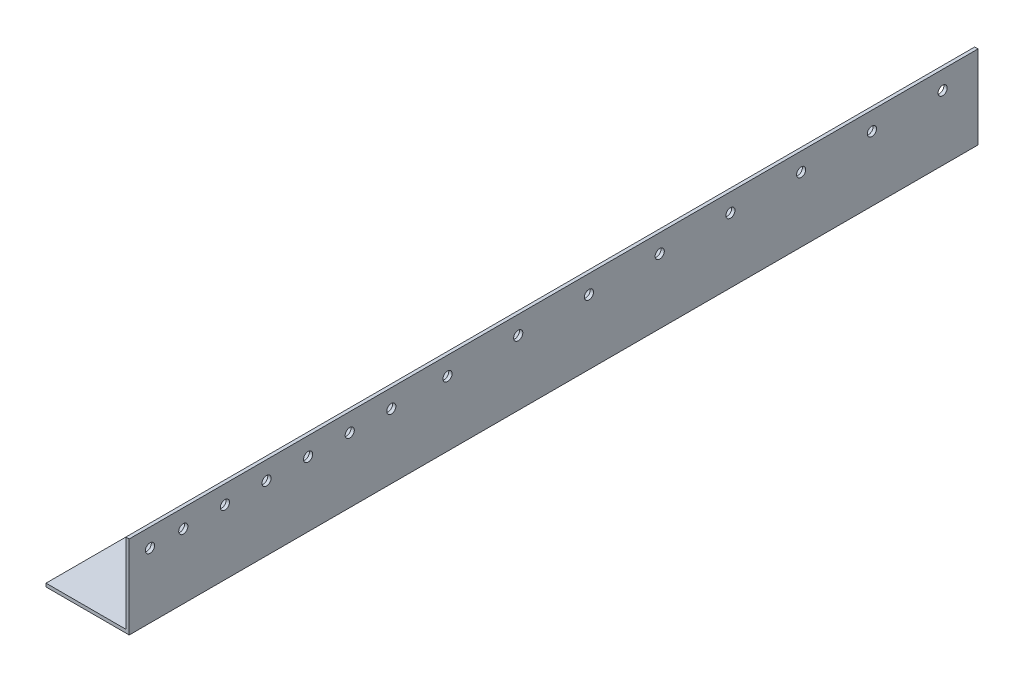
ISO-10303-21;
HEADER;
FILE_DESCRIPTION(('STEP AP214'),'2;1');
FILE_NAME('part.step','',(''),(''),'','','');
FILE_SCHEMA(('AUTOMOTIVE_DESIGN { 1 0 10303 214 1 1 1 1 }'));
ENDSEC;
DATA;
#1=APPLICATION_CONTEXT('core data for automotive mechanical design processes');
#2=APPLICATION_PROTOCOL_DEFINITION('international standard','automotive_design',2000,#1);
#3=PRODUCT_CONTEXT('',#1,'mechanical');
#4=PRODUCT('Part','Part','',(#3));
#5=PRODUCT_RELATED_PRODUCT_CATEGORY('part','',(#4));
#6=PRODUCT_DEFINITION_FORMATION('','',#4);
#7=PRODUCT_DEFINITION_CONTEXT('part definition',#1,'design');
#8=PRODUCT_DEFINITION('design','',#6,#7);
#9=PRODUCT_DEFINITION_SHAPE('','',#8);
#10=(LENGTH_UNIT() NAMED_UNIT(*) SI_UNIT(.MILLI.,.METRE.));
#11=(NAMED_UNIT(*) PLANE_ANGLE_UNIT() SI_UNIT($,.RADIAN.));
#12=(NAMED_UNIT(*) SI_UNIT($,.STERADIAN.) SOLID_ANGLE_UNIT());
#13=UNCERTAINTY_MEASURE_WITH_UNIT(LENGTH_MEASURE(1.E-05),#10,'distance_accuracy_value','');
#14=(GEOMETRIC_REPRESENTATION_CONTEXT(3) GLOBAL_UNCERTAINTY_ASSIGNED_CONTEXT((#13)) GLOBAL_UNIT_ASSIGNED_CONTEXT((#10,
#11,#12)) REPRESENTATION_CONTEXT('',''));
#15=CARTESIAN_POINT('',(0.,0.,0.));
#16=DIRECTION('',(0.,0.,1.));
#17=DIRECTION('',(1.,0.,0.));
#18=AXIS2_PLACEMENT_3D('',#15,#16,#17);
#19=CARTESIAN_POINT('',(0.,50.,510.));
#20=DIRECTION('',(-1.,0.,0.));
#21=DIRECTION('',(0.,0.,1.));
#22=AXIS2_PLACEMENT_3D('',#19,#20,#21);
#23=PLANE('',#22);
#24=CARTESIAN_POINT('',(0.,39.,21.25));
#25=DIRECTION('',(-1.,0.,0.));
#26=DIRECTION('',(0.,0.,1.));
#27=AXIS2_PLACEMENT_3D('',#24,#25,#26);
#28=CIRCLE('',#27,2.75);
#29=CARTESIAN_POINT('',(0.,39.,24.));
#30=VERTEX_POINT('',#29);
#31=EDGE_CURVE('E127',#30,#30,#28,.T.);
#32=ORIENTED_EDGE('',*,*,#31,.T.);
#33=EDGE_LOOP('',(#32));
#34=FACE_BOUND('',#33,.T.);
#35=CARTESIAN_POINT('',(0.,39.,63.75));
#36=DIRECTION('',(-1.,0.,0.));
#37=DIRECTION('',(0.,0.,1.));
#38=AXIS2_PLACEMENT_3D('',#35,#36,#37);
#39=CIRCLE('',#38,2.75);
#40=CARTESIAN_POINT('',(0.,39.,66.5));
#41=VERTEX_POINT('',#40);
#42=EDGE_CURVE('E193',#41,#41,#39,.T.);
#43=ORIENTED_EDGE('',*,*,#42,.T.);
#44=EDGE_LOOP('',(#43));
#45=FACE_BOUND('',#44,.T.);
#46=CARTESIAN_POINT('',(0.,39.,106.25));
#47=DIRECTION('',(-1.,0.,0.));
#48=DIRECTION('',(0.,0.,1.));
#49=AXIS2_PLACEMENT_3D('',#46,#47,#48);
#50=CIRCLE('',#49,2.75);
#51=CARTESIAN_POINT('',(0.,39.,109.));
#52=VERTEX_POINT('',#51);
#53=EDGE_CURVE('E190',#52,#52,#50,.T.);
#54=ORIENTED_EDGE('',*,*,#53,.T.);
#55=EDGE_LOOP('',(#54));
#56=FACE_BOUND('',#55,.T.);
#57=CARTESIAN_POINT('',(0.,39.,148.75));
#58=DIRECTION('',(-1.,0.,0.));
#59=DIRECTION('',(0.,0.,1.));
#60=AXIS2_PLACEMENT_3D('',#57,#58,#59);
#61=CIRCLE('',#60,2.75);
#62=CARTESIAN_POINT('',(0.,39.,151.5));
#63=VERTEX_POINT('',#62);
#64=EDGE_CURVE('E187',#63,#63,#61,.T.);
#65=ORIENTED_EDGE('',*,*,#64,.T.);
#66=EDGE_LOOP('',(#65));
#67=FACE_BOUND('',#66,.T.);
#68=CARTESIAN_POINT('',(0.,39.,191.25));
#69=DIRECTION('',(-1.,0.,0.));
#70=DIRECTION('',(0.,0.,1.));
#71=AXIS2_PLACEMENT_3D('',#68,#69,#70);
#72=CIRCLE('',#71,2.75);
#73=CARTESIAN_POINT('',(0.,39.,194.));
#74=VERTEX_POINT('',#73);
#75=EDGE_CURVE('E183',#74,#74,#72,.T.);
#76=ORIENTED_EDGE('',*,*,#75,.T.);
#77=EDGE_LOOP('',(#76));
#78=FACE_BOUND('',#77,.T.);
#79=CARTESIAN_POINT('',(0.,39.,233.75));
#80=DIRECTION('',(-1.,0.,0.));
#81=DIRECTION('',(0.,0.,1.));
#82=AXIS2_PLACEMENT_3D('',#79,#80,#81);
#83=CIRCLE('',#82,2.75);
#84=CARTESIAN_POINT('',(0.,39.,236.5));
#85=VERTEX_POINT('',#84);
#86=EDGE_CURVE('E179',#85,#85,#83,.T.);
#87=ORIENTED_EDGE('',*,*,#86,.T.);
#88=EDGE_LOOP('',(#87));
#89=FACE_BOUND('',#88,.T.);
#90=CARTESIAN_POINT('',(0.,39.,276.25));
#91=DIRECTION('',(-1.,0.,0.));
#92=DIRECTION('',(0.,0.,1.));
#93=AXIS2_PLACEMENT_3D('',#90,#91,#92);
#94=CIRCLE('',#93,2.74999999999997);
#95=CARTESIAN_POINT('',(0.,39.,279.));
#96=VERTEX_POINT('',#95);
#97=EDGE_CURVE('E175',#96,#96,#94,.T.);
#98=ORIENTED_EDGE('',*,*,#97,.T.);
#99=EDGE_LOOP('',(#98));
#100=FACE_BOUND('',#99,.T.);
#101=CARTESIAN_POINT('',(0.,39.,318.75));
#102=DIRECTION('',(-1.,0.,0.));
#103=DIRECTION('',(0.,0.,1.));
#104=AXIS2_PLACEMENT_3D('',#101,#102,#103);
#105=CIRCLE('',#104,2.74999999999997);
#106=CARTESIAN_POINT('',(0.,39.,321.5));
#107=VERTEX_POINT('',#106);
#108=EDGE_CURVE('E171',#107,#107,#105,.T.);
#109=ORIENTED_EDGE('',*,*,#108,.T.);
#110=EDGE_LOOP('',(#109));
#111=FACE_BOUND('',#110,.T.);
#112=CARTESIAN_POINT('',(0.,39.,352.5));
#113=DIRECTION('',(-1.,0.,0.));
#114=DIRECTION('',(0.,0.,1.));
#115=AXIS2_PLACEMENT_3D('',#112,#113,#114);
#116=CIRCLE('',#115,2.74999999999997);
#117=CARTESIAN_POINT('',(0.,39.,355.25));
#118=VERTEX_POINT('',#117);
#119=EDGE_CURVE('E167',#118,#118,#116,.T.);
#120=ORIENTED_EDGE('',*,*,#119,.T.);
#121=EDGE_LOOP('',(#120));
#122=FACE_BOUND('',#121,.T.);
#123=CARTESIAN_POINT('',(0.,39.,377.5));
#124=DIRECTION('',(-1.,0.,0.));
#125=DIRECTION('',(0.,0.,1.));
#126=AXIS2_PLACEMENT_3D('',#123,#124,#125);
#127=CIRCLE('',#126,2.74999999999997);
#128=CARTESIAN_POINT('',(0.,39.,380.25));
#129=VERTEX_POINT('',#128);
#130=EDGE_CURVE('E163',#129,#129,#127,.T.);
#131=ORIENTED_EDGE('',*,*,#130,.T.);
#132=EDGE_LOOP('',(#131));
#133=FACE_BOUND('',#132,.T.);
#134=CARTESIAN_POINT('',(0.,39.,402.5));
#135=DIRECTION('',(-1.,0.,0.));
#136=DIRECTION('',(0.,0.,1.));
#137=AXIS2_PLACEMENT_3D('',#134,#135,#136);
#138=CIRCLE('',#137,2.74999999999997);
#139=CARTESIAN_POINT('',(0.,39.,405.25));
#140=VERTEX_POINT('',#139);
#141=EDGE_CURVE('E159',#140,#140,#138,.T.);
#142=ORIENTED_EDGE('',*,*,#141,.T.);
#143=EDGE_LOOP('',(#142));
#144=FACE_BOUND('',#143,.T.);
#145=CARTESIAN_POINT('',(0.,39.,427.5));
#146=DIRECTION('',(-1.,0.,0.));
#147=DIRECTION('',(0.,0.,1.));
#148=AXIS2_PLACEMENT_3D('',#145,#146,#147);
#149=CIRCLE('',#148,2.74999999999997);
#150=CARTESIAN_POINT('',(0.,39.,430.25));
#151=VERTEX_POINT('',#150);
#152=EDGE_CURVE('E155',#151,#151,#149,.T.);
#153=ORIENTED_EDGE('',*,*,#152,.T.);
#154=EDGE_LOOP('',(#153));
#155=FACE_BOUND('',#154,.T.);
#156=CARTESIAN_POINT('',(0.,39.,452.5));
#157=DIRECTION('',(-1.,0.,0.));
#158=DIRECTION('',(0.,0.,1.));
#159=AXIS2_PLACEMENT_3D('',#156,#157,#158);
#160=CIRCLE('',#159,2.74999999999997);
#161=CARTESIAN_POINT('',(0.,39.,455.25));
#162=VERTEX_POINT('',#161);
#163=EDGE_CURVE('E151',#162,#162,#160,.T.);
#164=ORIENTED_EDGE('',*,*,#163,.T.);
#165=EDGE_LOOP('',(#164));
#166=FACE_BOUND('',#165,.T.);
#167=CARTESIAN_POINT('',(0.,39.,477.5));
#168=DIRECTION('',(-1.,0.,0.));
#169=DIRECTION('',(0.,0.,1.));
#170=AXIS2_PLACEMENT_3D('',#167,#168,#169);
#171=CIRCLE('',#170,2.74999999999997);
#172=CARTESIAN_POINT('',(0.,39.,480.25));
#173=VERTEX_POINT('',#172);
#174=EDGE_CURVE('E147',#173,#173,#171,.T.);
#175=ORIENTED_EDGE('',*,*,#174,.T.);
#176=EDGE_LOOP('',(#175));
#177=FACE_BOUND('',#176,.T.);
#178=CARTESIAN_POINT('',(0.,39.,497.5));
#179=DIRECTION('',(-1.,0.,0.));
#180=DIRECTION('',(0.,0.,1.));
#181=AXIS2_PLACEMENT_3D('',#178,#179,#180);
#182=CIRCLE('',#181,2.74999999999997);
#183=CARTESIAN_POINT('',(0.,39.,500.25));
#184=VERTEX_POINT('',#183);
#185=EDGE_CURVE('E143',#184,#184,#182,.T.);
#186=ORIENTED_EDGE('',*,*,#185,.T.);
#187=EDGE_LOOP('',(#186));
#188=FACE_BOUND('',#187,.T.);
#189=DIRECTION('',(0.,1.,0.));
#190=VECTOR('',#189,1.);
#191=CARTESIAN_POINT('',(0.,50.,0.));
#192=LINE('',#191,#190);
#193=CARTESIAN_POINT('',(0.,0.,0.));
#194=VERTEX_POINT('',#193);
#195=CARTESIAN_POINT('',(0.,50.,0.));
#196=VERTEX_POINT('',#195);
#197=EDGE_CURVE('E123',#194,#196,#192,.T.);
#198=ORIENTED_EDGE('',*,*,#197,.T.);
#199=DIRECTION('',(0.,0.,-1.));
#200=VECTOR('',#199,1.);
#201=CARTESIAN_POINT('',(0.,50.,510.));
#202=LINE('',#201,#200);
#203=CARTESIAN_POINT('',(0.,50.,510.));
#204=VERTEX_POINT('',#203);
#205=EDGE_CURVE('E11',#204,#196,#202,.T.);
#206=ORIENTED_EDGE('',*,*,#205,.F.);
#207=DIRECTION('',(0.,1.,0.));
#208=VECTOR('',#207,1.);
#209=CARTESIAN_POINT('',(0.,50.,510.));
#210=LINE('',#209,#208);
#211=CARTESIAN_POINT('',(0.,0.,510.));
#212=VERTEX_POINT('',#211);
#213=EDGE_CURVE('E134',#212,#204,#210,.T.);
#214=ORIENTED_EDGE('',*,*,#213,.F.);
#215=DIRECTION('',(0.,0.,-1.));
#216=VECTOR('',#215,1.);
#217=CARTESIAN_POINT('',(0.,0.,510.));
#218=LINE('',#217,#216);
#219=EDGE_CURVE('E119',#212,#194,#218,.T.);
#220=ORIENTED_EDGE('',*,*,#219,.T.);
#221=EDGE_LOOP('',(#198,#206,#214,#220));
#222=FACE_BOUND('',#221,.T.);
#223=ADVANCED_FACE('F37',(#34,#45,#56,#67,#78,#89,#100,#111,#122,#133,#144,#155,#166,#177,#188,
#222),#23,.F.);
#224=CARTESIAN_POINT('',(-2.,50.,510.));
#225=DIRECTION('',(0.,-1.,0.));
#226=DIRECTION('',(0.,0.,-1.));
#227=AXIS2_PLACEMENT_3D('',#224,#225,#226);
#228=PLANE('',#227);
#229=DIRECTION('',(-1.,0.,0.));
#230=VECTOR('',#229,1.);
#231=CARTESIAN_POINT('',(-2.,50.,0.));
#232=LINE('',#231,#230);
#233=CARTESIAN_POINT('',(-2.,50.,0.));
#234=VERTEX_POINT('',#233);
#235=EDGE_CURVE('E126',#196,#234,#232,.T.);
#236=ORIENTED_EDGE('',*,*,#235,.T.);
#237=DIRECTION('',(0.,0.,-1.));
#238=VECTOR('',#237,1.);
#239=CARTESIAN_POINT('',(-2.,50.,510.));
#240=LINE('',#239,#238);
#241=CARTESIAN_POINT('',(-2.,50.,510.));
#242=VERTEX_POINT('',#241);
#243=EDGE_CURVE('E46',#242,#234,#240,.T.);
#244=ORIENTED_EDGE('',*,*,#243,.F.);
#245=DIRECTION('',(-1.,0.,0.));
#246=VECTOR('',#245,1.);
#247=CARTESIAN_POINT('',(-2.,50.,510.));
#248=LINE('',#247,#246);
#249=EDGE_CURVE('E92',#204,#242,#248,.T.);
#250=ORIENTED_EDGE('',*,*,#249,.F.);
#251=ORIENTED_EDGE('',*,*,#205,.T.);
#252=EDGE_LOOP('',(#236,#244,#250,#251));
#253=FACE_BOUND('',#252,.T.);
#254=ADVANCED_FACE('F210',(#253),#228,.F.);
#255=CARTESIAN_POINT('',(-2.,2.,510.));
#256=DIRECTION('',(1.,0.,0.));
#257=DIRECTION('',(0.,0.,-1.));
#258=AXIS2_PLACEMENT_3D('',#255,#256,#257);
#259=PLANE('',#258);
#260=CARTESIAN_POINT('',(-2.,39.,21.25));
#261=DIRECTION('',(1.,0.,0.));
#262=DIRECTION('',(0.,0.,-1.));
#263=AXIS2_PLACEMENT_3D('',#260,#261,#262);
#264=CIRCLE('',#263,2.75);
#265=CARTESIAN_POINT('',(-2.,39.,18.5));
#266=VERTEX_POINT('',#265);
#267=EDGE_CURVE('E40',#266,#266,#264,.T.);
#268=ORIENTED_EDGE('',*,*,#267,.T.);
#269=EDGE_LOOP('',(#268));
#270=FACE_BOUND('',#269,.T.);
#271=CARTESIAN_POINT('',(-2.,39.,63.75));
#272=DIRECTION('',(1.,0.,0.));
#273=DIRECTION('',(0.,0.,-1.));
#274=AXIS2_PLACEMENT_3D('',#271,#272,#273);
#275=CIRCLE('',#274,2.75);
#276=CARTESIAN_POINT('',(-2.,39.,61.));
#277=VERTEX_POINT('',#276);
#278=EDGE_CURVE('E191',#277,#277,#275,.T.);
#279=ORIENTED_EDGE('',*,*,#278,.T.);
#280=EDGE_LOOP('',(#279));
#281=FACE_BOUND('',#280,.T.);
#282=CARTESIAN_POINT('',(-2.,39.,106.25));
#283=DIRECTION('',(1.,0.,0.));
#284=DIRECTION('',(0.,0.,-1.));
#285=AXIS2_PLACEMENT_3D('',#282,#283,#284);
#286=CIRCLE('',#285,2.75);
#287=CARTESIAN_POINT('',(-2.,39.,103.5));
#288=VERTEX_POINT('',#287);
#289=EDGE_CURVE('E188',#288,#288,#286,.T.);
#290=ORIENTED_EDGE('',*,*,#289,.T.);
#291=EDGE_LOOP('',(#290));
#292=FACE_BOUND('',#291,.T.);
#293=CARTESIAN_POINT('',(-2.,39.,148.75));
#294=DIRECTION('',(1.,0.,0.));
#295=DIRECTION('',(0.,0.,-1.));
#296=AXIS2_PLACEMENT_3D('',#293,#294,#295);
#297=CIRCLE('',#296,2.75);
#298=CARTESIAN_POINT('',(-2.,39.,146.));
#299=VERTEX_POINT('',#298);
#300=EDGE_CURVE('E184',#299,#299,#297,.T.);
#301=ORIENTED_EDGE('',*,*,#300,.T.);
#302=EDGE_LOOP('',(#301));
#303=FACE_BOUND('',#302,.T.);
#304=CARTESIAN_POINT('',(-2.,39.,191.25));
#305=DIRECTION('',(1.,0.,0.));
#306=DIRECTION('',(0.,0.,-1.));
#307=AXIS2_PLACEMENT_3D('',#304,#305,#306);
#308=CIRCLE('',#307,2.75);
#309=CARTESIAN_POINT('',(-2.,39.,188.5));
#310=VERTEX_POINT('',#309);
#311=EDGE_CURVE('E180',#310,#310,#308,.T.);
#312=ORIENTED_EDGE('',*,*,#311,.T.);
#313=EDGE_LOOP('',(#312));
#314=FACE_BOUND('',#313,.T.);
#315=CARTESIAN_POINT('',(-2.,39.,233.75));
#316=DIRECTION('',(1.,0.,0.));
#317=DIRECTION('',(0.,0.,-1.));
#318=AXIS2_PLACEMENT_3D('',#315,#316,#317);
#319=CIRCLE('',#318,2.75);
#320=CARTESIAN_POINT('',(-2.,39.,231.));
#321=VERTEX_POINT('',#320);
#322=EDGE_CURVE('E176',#321,#321,#319,.T.);
#323=ORIENTED_EDGE('',*,*,#322,.T.);
#324=EDGE_LOOP('',(#323));
#325=FACE_BOUND('',#324,.T.);
#326=CARTESIAN_POINT('',(-2.,39.,276.25));
#327=DIRECTION('',(1.,0.,0.));
#328=DIRECTION('',(0.,0.,-1.));
#329=AXIS2_PLACEMENT_3D('',#326,#327,#328);
#330=CIRCLE('',#329,2.74999999999997);
#331=CARTESIAN_POINT('',(-2.,39.,273.5));
#332=VERTEX_POINT('',#331);
#333=EDGE_CURVE('E172',#332,#332,#330,.T.);
#334=ORIENTED_EDGE('',*,*,#333,.T.);
#335=EDGE_LOOP('',(#334));
#336=FACE_BOUND('',#335,.T.);
#337=CARTESIAN_POINT('',(-2.,39.,318.75));
#338=DIRECTION('',(1.,0.,0.));
#339=DIRECTION('',(0.,0.,-1.));
#340=AXIS2_PLACEMENT_3D('',#337,#338,#339);
#341=CIRCLE('',#340,2.74999999999997);
#342=CARTESIAN_POINT('',(-2.,39.,316.));
#343=VERTEX_POINT('',#342);
#344=EDGE_CURVE('E168',#343,#343,#341,.T.);
#345=ORIENTED_EDGE('',*,*,#344,.T.);
#346=EDGE_LOOP('',(#345));
#347=FACE_BOUND('',#346,.T.);
#348=CARTESIAN_POINT('',(-2.,39.,352.5));
#349=DIRECTION('',(1.,0.,0.));
#350=DIRECTION('',(0.,0.,-1.));
#351=AXIS2_PLACEMENT_3D('',#348,#349,#350);
#352=CIRCLE('',#351,2.74999999999997);
#353=CARTESIAN_POINT('',(-2.,39.,349.75));
#354=VERTEX_POINT('',#353);
#355=EDGE_CURVE('E164',#354,#354,#352,.T.);
#356=ORIENTED_EDGE('',*,*,#355,.T.);
#357=EDGE_LOOP('',(#356));
#358=FACE_BOUND('',#357,.T.);
#359=CARTESIAN_POINT('',(-2.,39.,377.5));
#360=DIRECTION('',(1.,0.,0.));
#361=DIRECTION('',(0.,0.,-1.));
#362=AXIS2_PLACEMENT_3D('',#359,#360,#361);
#363=CIRCLE('',#362,2.74999999999997);
#364=CARTESIAN_POINT('',(-2.,39.,374.75));
#365=VERTEX_POINT('',#364);
#366=EDGE_CURVE('E160',#365,#365,#363,.T.);
#367=ORIENTED_EDGE('',*,*,#366,.T.);
#368=EDGE_LOOP('',(#367));
#369=FACE_BOUND('',#368,.T.);
#370=CARTESIAN_POINT('',(-2.,39.,402.5));
#371=DIRECTION('',(1.,0.,0.));
#372=DIRECTION('',(0.,0.,-1.));
#373=AXIS2_PLACEMENT_3D('',#370,#371,#372);
#374=CIRCLE('',#373,2.74999999999997);
#375=CARTESIAN_POINT('',(-2.,39.,399.75));
#376=VERTEX_POINT('',#375);
#377=EDGE_CURVE('E156',#376,#376,#374,.T.);
#378=ORIENTED_EDGE('',*,*,#377,.T.);
#379=EDGE_LOOP('',(#378));
#380=FACE_BOUND('',#379,.T.);
#381=CARTESIAN_POINT('',(-2.,39.,427.5));
#382=DIRECTION('',(1.,0.,0.));
#383=DIRECTION('',(0.,0.,-1.));
#384=AXIS2_PLACEMENT_3D('',#381,#382,#383);
#385=CIRCLE('',#384,2.74999999999997);
#386=CARTESIAN_POINT('',(-2.,39.,424.75));
#387=VERTEX_POINT('',#386);
#388=EDGE_CURVE('E152',#387,#387,#385,.T.);
#389=ORIENTED_EDGE('',*,*,#388,.T.);
#390=EDGE_LOOP('',(#389));
#391=FACE_BOUND('',#390,.T.);
#392=CARTESIAN_POINT('',(-2.,39.,452.5));
#393=DIRECTION('',(1.,0.,0.));
#394=DIRECTION('',(0.,0.,-1.));
#395=AXIS2_PLACEMENT_3D('',#392,#393,#394);
#396=CIRCLE('',#395,2.74999999999997);
#397=CARTESIAN_POINT('',(-2.,39.,449.75));
#398=VERTEX_POINT('',#397);
#399=EDGE_CURVE('E148',#398,#398,#396,.T.);
#400=ORIENTED_EDGE('',*,*,#399,.T.);
#401=EDGE_LOOP('',(#400));
#402=FACE_BOUND('',#401,.T.);
#403=CARTESIAN_POINT('',(-2.,39.,477.5));
#404=DIRECTION('',(1.,0.,0.));
#405=DIRECTION('',(0.,0.,-1.));
#406=AXIS2_PLACEMENT_3D('',#403,#404,#405);
#407=CIRCLE('',#406,2.74999999999997);
#408=CARTESIAN_POINT('',(-2.,39.,474.75));
#409=VERTEX_POINT('',#408);
#410=EDGE_CURVE('E144',#409,#409,#407,.T.);
#411=ORIENTED_EDGE('',*,*,#410,.T.);
#412=EDGE_LOOP('',(#411));
#413=FACE_BOUND('',#412,.T.);
#414=CARTESIAN_POINT('',(-2.,39.,497.5));
#415=DIRECTION('',(1.,0.,0.));
#416=DIRECTION('',(0.,0.,-1.));
#417=AXIS2_PLACEMENT_3D('',#414,#415,#416);
#418=CIRCLE('',#417,2.74999999999997);
#419=CARTESIAN_POINT('',(-2.,39.,494.75));
#420=VERTEX_POINT('',#419);
#421=EDGE_CURVE('E140',#420,#420,#418,.T.);
#422=ORIENTED_EDGE('',*,*,#421,.T.);
#423=EDGE_LOOP('',(#422));
#424=FACE_BOUND('',#423,.T.);
#425=DIRECTION('',(0.,-1.,0.));
#426=VECTOR('',#425,1.);
#427=CARTESIAN_POINT('',(-2.,2.,0.));
#428=LINE('',#427,#426);
#429=CARTESIAN_POINT('',(-2.,2.,0.));
#430=VERTEX_POINT('',#429);
#431=EDGE_CURVE('E129',#234,#430,#428,.T.);
#432=ORIENTED_EDGE('',*,*,#431,.T.);
#433=DIRECTION('',(0.,0.,-1.));
#434=VECTOR('',#433,1.);
#435=CARTESIAN_POINT('',(-2.,2.,510.));
#436=LINE('',#435,#434);
#437=CARTESIAN_POINT('',(-2.,2.,510.));
#438=VERTEX_POINT('',#437);
#439=EDGE_CURVE('E114',#438,#430,#436,.T.);
#440=ORIENTED_EDGE('',*,*,#439,.F.);
#441=DIRECTION('',(0.,-1.,0.));
#442=VECTOR('',#441,1.);
#443=CARTESIAN_POINT('',(-2.,2.,510.));
#444=LINE('',#443,#442);
#445=EDGE_CURVE('E105',#242,#438,#444,.T.);
#446=ORIENTED_EDGE('',*,*,#445,.F.);
#447=ORIENTED_EDGE('',*,*,#243,.T.);
#448=EDGE_LOOP('',(#432,#440,#446,#447));
#449=FACE_BOUND('',#448,.T.);
#450=ADVANCED_FACE('F213',(#270,#281,#292,#303,#314,#325,#336,#347,#358,#369,#380,#391,#402,
#413,#424,#449),#259,.F.);
#451=CARTESIAN_POINT('',(-50.,2.,510.));
#452=DIRECTION('',(0.,-1.,0.));
#453=DIRECTION('',(0.,0.,-1.));
#454=AXIS2_PLACEMENT_3D('',#451,#452,#453);
#455=PLANE('',#454);
#456=DIRECTION('',(-1.,0.,0.));
#457=VECTOR('',#456,1.);
#458=CARTESIAN_POINT('',(-50.,2.,0.));
#459=LINE('',#458,#457);
#460=CARTESIAN_POINT('',(-50.,2.,0.));
#461=VERTEX_POINT('',#460);
#462=EDGE_CURVE('E113',#430,#461,#459,.T.);
#463=ORIENTED_EDGE('',*,*,#462,.T.);
#464=DIRECTION('',(0.,0.,-1.));
#465=VECTOR('',#464,1.);
#466=CARTESIAN_POINT('',(-50.,2.,510.));
#467=LINE('',#466,#465);
#468=CARTESIAN_POINT('',(-50.,2.,510.));
#469=VERTEX_POINT('',#468);
#470=EDGE_CURVE('E110',#469,#461,#467,.T.);
#471=ORIENTED_EDGE('',*,*,#470,.F.);
#472=DIRECTION('',(-1.,0.,0.));
#473=VECTOR('',#472,1.);
#474=CARTESIAN_POINT('',(-50.,2.,510.));
#475=LINE('',#474,#473);
#476=EDGE_CURVE('E99',#438,#469,#475,.T.);
#477=ORIENTED_EDGE('',*,*,#476,.F.);
#478=ORIENTED_EDGE('',*,*,#439,.T.);
#479=EDGE_LOOP('',(#463,#471,#477,#478));
#480=FACE_BOUND('',#479,.T.);
#481=ADVANCED_FACE('F111',(#480),#455,.F.);
#482=CARTESIAN_POINT('',(-50.,0.,510.));
#483=DIRECTION('',(1.,0.,0.));
#484=DIRECTION('',(0.,0.,-1.));
#485=AXIS2_PLACEMENT_3D('',#482,#483,#484);
#486=PLANE('',#485);
#487=DIRECTION('',(0.,-1.,0.));
#488=VECTOR('',#487,1.);
#489=CARTESIAN_POINT('',(-50.,0.,0.));
#490=LINE('',#489,#488);
#491=CARTESIAN_POINT('',(-50.,0.,0.));
#492=VERTEX_POINT('',#491);
#493=EDGE_CURVE('E78',#461,#492,#490,.T.);
#494=ORIENTED_EDGE('',*,*,#493,.T.);
#495=DIRECTION('',(0.,0.,-1.));
#496=VECTOR('',#495,1.);
#497=CARTESIAN_POINT('',(-50.,0.,510.));
#498=LINE('',#497,#496);
#499=CARTESIAN_POINT('',(-50.,0.,510.));
#500=VERTEX_POINT('',#499);
#501=EDGE_CURVE('E115',#500,#492,#498,.T.);
#502=ORIENTED_EDGE('',*,*,#501,.F.);
#503=DIRECTION('',(0.,-1.,0.));
#504=VECTOR('',#503,1.);
#505=CARTESIAN_POINT('',(-50.,0.,510.));
#506=LINE('',#505,#504);
#507=EDGE_CURVE('E103',#469,#500,#506,.T.);
#508=ORIENTED_EDGE('',*,*,#507,.F.);
#509=ORIENTED_EDGE('',*,*,#470,.T.);
#510=EDGE_LOOP('',(#494,#502,#508,#509));
#511=FACE_BOUND('',#510,.T.);
#512=ADVANCED_FACE('F117',(#511),#486,.F.);
#513=CARTESIAN_POINT('',(0.,0.,510.));
#514=DIRECTION('',(0.,1.,0.));
#515=DIRECTION('',(0.,0.,1.));
#516=AXIS2_PLACEMENT_3D('',#513,#514,#515);
#517=PLANE('',#516);
#518=DIRECTION('',(1.,0.,0.));
#519=VECTOR('',#518,1.);
#520=CARTESIAN_POINT('',(0.,0.,0.));
#521=LINE('',#520,#519);
#522=EDGE_CURVE('E84',#492,#194,#521,.T.);
#523=ORIENTED_EDGE('',*,*,#522,.T.);
#524=ORIENTED_EDGE('',*,*,#219,.F.);
#525=DIRECTION('',(1.,0.,0.));
#526=VECTOR('',#525,1.);
#527=CARTESIAN_POINT('',(0.,0.,510.));
#528=LINE('',#527,#526);
#529=EDGE_CURVE('E55',#500,#212,#528,.T.);
#530=ORIENTED_EDGE('',*,*,#529,.F.);
#531=ORIENTED_EDGE('',*,*,#501,.T.);
#532=EDGE_LOOP('',(#523,#524,#530,#531));
#533=FACE_BOUND('',#532,.T.);
#534=ADVANCED_FACE('F218',(#533),#517,.F.);
#535=CARTESIAN_POINT('',(0.,0.,510.));
#536=DIRECTION('',(0.,0.,-1.));
#537=DIRECTION('',(-1.,0.,0.));
#538=AXIS2_PLACEMENT_3D('',#535,#536,#537);
#539=PLANE('',#538);
#540=ORIENTED_EDGE('',*,*,#213,.T.);
#541=ORIENTED_EDGE('',*,*,#249,.T.);
#542=ORIENTED_EDGE('',*,*,#445,.T.);
#543=ORIENTED_EDGE('',*,*,#476,.T.);
#544=ORIENTED_EDGE('',*,*,#507,.T.);
#545=ORIENTED_EDGE('',*,*,#529,.T.);
#546=EDGE_LOOP('',(#540,#541,#542,#543,#544,#545));
#547=FACE_BOUND('',#546,.T.);
#548=ADVANCED_FACE('F101',(#547),#539,.F.);
#549=CARTESIAN_POINT('',(0.,0.,0.));
#550=DIRECTION('',(0.,0.,-1.));
#551=DIRECTION('',(-1.,0.,0.));
#552=AXIS2_PLACEMENT_3D('',#549,#550,#551);
#553=PLANE('',#552);
#554=ORIENTED_EDGE('',*,*,#197,.F.);
#555=ORIENTED_EDGE('',*,*,#522,.F.);
#556=ORIENTED_EDGE('',*,*,#493,.F.);
#557=ORIENTED_EDGE('',*,*,#462,.F.);
#558=ORIENTED_EDGE('',*,*,#431,.F.);
#559=ORIENTED_EDGE('',*,*,#235,.F.);
#560=EDGE_LOOP('',(#554,#555,#556,#557,#558,#559));
#561=FACE_BOUND('',#560,.T.);
#562=ADVANCED_FACE('F216',(#561),#553,.T.);
#563=CARTESIAN_POINT('',(-5.,39.,497.5));
#564=DIRECTION('',(1.,0.,0.));
#565=DIRECTION('',(0.,0.,-1.));
#566=AXIS2_PLACEMENT_3D('',#563,#564,#565);
#567=CYLINDRICAL_SURFACE('',#566,2.74999999999997);
#568=ORIENTED_EDGE('',*,*,#421,.F.);
#569=EDGE_LOOP('',(#568));
#570=FACE_BOUND('',#569,.T.);
#571=ORIENTED_EDGE('',*,*,#185,.F.);
#572=EDGE_LOOP('',(#571));
#573=FACE_BOUND('',#572,.T.);
#574=ADVANCED_FACE('F283',(#570,#573),#567,.F.);
#575=CARTESIAN_POINT('',(-5.,39.,477.5));
#576=DIRECTION('',(1.,0.,0.));
#577=DIRECTION('',(0.,0.,-1.));
#578=AXIS2_PLACEMENT_3D('',#575,#576,#577);
#579=CYLINDRICAL_SURFACE('',#578,2.74999999999997);
#580=ORIENTED_EDGE('',*,*,#410,.F.);
#581=EDGE_LOOP('',(#580));
#582=FACE_BOUND('',#581,.T.);
#583=ORIENTED_EDGE('',*,*,#174,.F.);
#584=EDGE_LOOP('',(#583));
#585=FACE_BOUND('',#584,.T.);
#586=ADVANCED_FACE('F285',(#582,#585),#579,.F.);
#587=CARTESIAN_POINT('',(-5.,39.,452.5));
#588=DIRECTION('',(1.,0.,0.));
#589=DIRECTION('',(0.,0.,-1.));
#590=AXIS2_PLACEMENT_3D('',#587,#588,#589);
#591=CYLINDRICAL_SURFACE('',#590,2.74999999999997);
#592=ORIENTED_EDGE('',*,*,#399,.F.);
#593=EDGE_LOOP('',(#592));
#594=FACE_BOUND('',#593,.T.);
#595=ORIENTED_EDGE('',*,*,#163,.F.);
#596=EDGE_LOOP('',(#595));
#597=FACE_BOUND('',#596,.T.);
#598=ADVANCED_FACE('F292',(#594,#597),#591,.F.);
#599=CARTESIAN_POINT('',(-5.,39.,427.5));
#600=DIRECTION('',(1.,0.,0.));
#601=DIRECTION('',(0.,0.,-1.));
#602=AXIS2_PLACEMENT_3D('',#599,#600,#601);
#603=CYLINDRICAL_SURFACE('',#602,2.74999999999997);
#604=ORIENTED_EDGE('',*,*,#388,.F.);
#605=EDGE_LOOP('',(#604));
#606=FACE_BOUND('',#605,.T.);
#607=ORIENTED_EDGE('',*,*,#152,.F.);
#608=EDGE_LOOP('',(#607));
#609=FACE_BOUND('',#608,.T.);
#610=ADVANCED_FACE('F299',(#606,#609),#603,.F.);
#611=CARTESIAN_POINT('',(-5.,39.,402.5));
#612=DIRECTION('',(1.,0.,0.));
#613=DIRECTION('',(0.,0.,-1.));
#614=AXIS2_PLACEMENT_3D('',#611,#612,#613);
#615=CYLINDRICAL_SURFACE('',#614,2.74999999999997);
#616=ORIENTED_EDGE('',*,*,#377,.F.);
#617=EDGE_LOOP('',(#616));
#618=FACE_BOUND('',#617,.T.);
#619=ORIENTED_EDGE('',*,*,#141,.F.);
#620=EDGE_LOOP('',(#619));
#621=FACE_BOUND('',#620,.T.);
#622=ADVANCED_FACE('F303',(#618,#621),#615,.F.);
#623=CARTESIAN_POINT('',(-5.,39.,377.5));
#624=DIRECTION('',(1.,0.,0.));
#625=DIRECTION('',(0.,0.,-1.));
#626=AXIS2_PLACEMENT_3D('',#623,#624,#625);
#627=CYLINDRICAL_SURFACE('',#626,2.74999999999997);
#628=ORIENTED_EDGE('',*,*,#366,.F.);
#629=EDGE_LOOP('',(#628));
#630=FACE_BOUND('',#629,.T.);
#631=ORIENTED_EDGE('',*,*,#130,.F.);
#632=EDGE_LOOP('',(#631));
#633=FACE_BOUND('',#632,.T.);
#634=ADVANCED_FACE('F307',(#630,#633),#627,.F.);
#635=CARTESIAN_POINT('',(-5.,39.,352.5));
#636=DIRECTION('',(1.,0.,0.));
#637=DIRECTION('',(0.,0.,-1.));
#638=AXIS2_PLACEMENT_3D('',#635,#636,#637);
#639=CYLINDRICAL_SURFACE('',#638,2.74999999999997);
#640=ORIENTED_EDGE('',*,*,#355,.F.);
#641=EDGE_LOOP('',(#640));
#642=FACE_BOUND('',#641,.T.);
#643=ORIENTED_EDGE('',*,*,#119,.F.);
#644=EDGE_LOOP('',(#643));
#645=FACE_BOUND('',#644,.T.);
#646=ADVANCED_FACE('F311',(#642,#645),#639,.F.);
#647=CARTESIAN_POINT('',(-5.,39.,318.75));
#648=DIRECTION('',(1.,0.,0.));
#649=DIRECTION('',(0.,0.,-1.));
#650=AXIS2_PLACEMENT_3D('',#647,#648,#649);
#651=CYLINDRICAL_SURFACE('',#650,2.74999999999997);
#652=ORIENTED_EDGE('',*,*,#344,.F.);
#653=EDGE_LOOP('',(#652));
#654=FACE_BOUND('',#653,.T.);
#655=ORIENTED_EDGE('',*,*,#108,.F.);
#656=EDGE_LOOP('',(#655));
#657=FACE_BOUND('',#656,.T.);
#658=ADVANCED_FACE('F315',(#654,#657),#651,.F.);
#659=CARTESIAN_POINT('',(-5.,39.,276.25));
#660=DIRECTION('',(1.,0.,0.));
#661=DIRECTION('',(0.,0.,-1.));
#662=AXIS2_PLACEMENT_3D('',#659,#660,#661);
#663=CYLINDRICAL_SURFACE('',#662,2.74999999999997);
#664=ORIENTED_EDGE('',*,*,#333,.F.);
#665=EDGE_LOOP('',(#664));
#666=FACE_BOUND('',#665,.T.);
#667=ORIENTED_EDGE('',*,*,#97,.F.);
#668=EDGE_LOOP('',(#667));
#669=FACE_BOUND('',#668,.T.);
#670=ADVANCED_FACE('F319',(#666,#669),#663,.F.);
#671=CARTESIAN_POINT('',(-5.,39.,233.75));
#672=DIRECTION('',(1.,0.,0.));
#673=DIRECTION('',(0.,0.,-1.));
#674=AXIS2_PLACEMENT_3D('',#671,#672,#673);
#675=CYLINDRICAL_SURFACE('',#674,2.75);
#676=ORIENTED_EDGE('',*,*,#322,.F.);
#677=EDGE_LOOP('',(#676));
#678=FACE_BOUND('',#677,.T.);
#679=ORIENTED_EDGE('',*,*,#86,.F.);
#680=EDGE_LOOP('',(#679));
#681=FACE_BOUND('',#680,.T.);
#682=ADVANCED_FACE('F323',(#678,#681),#675,.F.);
#683=CARTESIAN_POINT('',(-5.,39.,191.25));
#684=DIRECTION('',(1.,0.,0.));
#685=DIRECTION('',(0.,0.,-1.));
#686=AXIS2_PLACEMENT_3D('',#683,#684,#685);
#687=CYLINDRICAL_SURFACE('',#686,2.75);
#688=ORIENTED_EDGE('',*,*,#311,.F.);
#689=EDGE_LOOP('',(#688));
#690=FACE_BOUND('',#689,.T.);
#691=ORIENTED_EDGE('',*,*,#75,.F.);
#692=EDGE_LOOP('',(#691));
#693=FACE_BOUND('',#692,.T.);
#694=ADVANCED_FACE('F327',(#690,#693),#687,.F.);
#695=CARTESIAN_POINT('',(-5.,39.,148.75));
#696=DIRECTION('',(1.,0.,0.));
#697=DIRECTION('',(0.,0.,-1.));
#698=AXIS2_PLACEMENT_3D('',#695,#696,#697);
#699=CYLINDRICAL_SURFACE('',#698,2.75);
#700=ORIENTED_EDGE('',*,*,#300,.F.);
#701=EDGE_LOOP('',(#700));
#702=FACE_BOUND('',#701,.T.);
#703=ORIENTED_EDGE('',*,*,#64,.F.);
#704=EDGE_LOOP('',(#703));
#705=FACE_BOUND('',#704,.T.);
#706=ADVANCED_FACE('F331',(#702,#705),#699,.F.);
#707=CARTESIAN_POINT('',(-5.,39.,106.25));
#708=DIRECTION('',(1.,0.,0.));
#709=DIRECTION('',(0.,0.,-1.));
#710=AXIS2_PLACEMENT_3D('',#707,#708,#709);
#711=CYLINDRICAL_SURFACE('',#710,2.75);
#712=ORIENTED_EDGE('',*,*,#289,.F.);
#713=EDGE_LOOP('',(#712));
#714=FACE_BOUND('',#713,.T.);
#715=ORIENTED_EDGE('',*,*,#53,.F.);
#716=EDGE_LOOP('',(#715));
#717=FACE_BOUND('',#716,.T.);
#718=ADVANCED_FACE('F335',(#714,#717),#711,.F.);
#719=CARTESIAN_POINT('',(-5.,39.,63.75));
#720=DIRECTION('',(1.,0.,0.));
#721=DIRECTION('',(0.,0.,-1.));
#722=AXIS2_PLACEMENT_3D('',#719,#720,#721);
#723=CYLINDRICAL_SURFACE('',#722,2.75);
#724=ORIENTED_EDGE('',*,*,#278,.F.);
#725=EDGE_LOOP('',(#724));
#726=FACE_BOUND('',#725,.T.);
#727=ORIENTED_EDGE('',*,*,#42,.F.);
#728=EDGE_LOOP('',(#727));
#729=FACE_BOUND('',#728,.T.);
#730=ADVANCED_FACE('F339',(#726,#729),#723,.F.);
#731=CARTESIAN_POINT('',(-5.,39.,21.25));
#732=DIRECTION('',(1.,0.,0.));
#733=DIRECTION('',(0.,0.,-1.));
#734=AXIS2_PLACEMENT_3D('',#731,#732,#733);
#735=CYLINDRICAL_SURFACE('',#734,2.75);
#736=ORIENTED_EDGE('',*,*,#267,.F.);
#737=EDGE_LOOP('',(#736));
#738=FACE_BOUND('',#737,.T.);
#739=ORIENTED_EDGE('',*,*,#31,.F.);
#740=EDGE_LOOP('',(#739));
#741=FACE_BOUND('',#740,.T.);
#742=ADVANCED_FACE('F343',(#738,#741),#735,.F.);
#743=CLOSED_SHELL('',(#223,#254,#450,#481,#512,#534,#548,#562,#574,#586,#598,#610,#622,#634,
#646,#658,#670,#682,#694,#706,#718,#730,#742));
#744=MANIFOLD_SOLID_BREP('B2',#743);
#745=ADVANCED_BREP_SHAPE_REPRESENTATION('',(#18,#744),#14);
#746=SHAPE_DEFINITION_REPRESENTATION(#9,#745);
ENDSEC;
END-ISO-10303-21;
